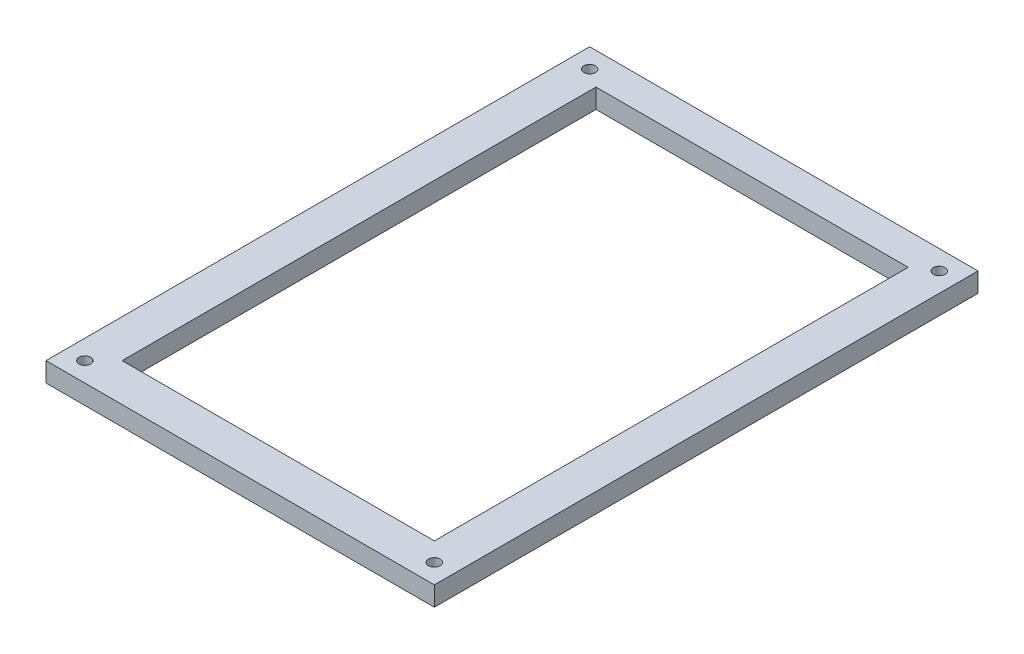
ISO-10303-21;
HEADER;
FILE_DESCRIPTION(('STEP AP214'),'2;1');
FILE_NAME('part.step','',(''),(''),'','','');
FILE_SCHEMA(('AUTOMOTIVE_DESIGN { 1 0 10303 214 1 1 1 1 }'));
ENDSEC;
DATA;
#1=APPLICATION_CONTEXT('core data for automotive mechanical design processes');
#2=APPLICATION_PROTOCOL_DEFINITION('international standard','automotive_design',2000,#1);
#3=PRODUCT_CONTEXT('',#1,'mechanical');
#4=PRODUCT('Part','Part','',(#3));
#5=PRODUCT_RELATED_PRODUCT_CATEGORY('part','',(#4));
#6=PRODUCT_DEFINITION_FORMATION('','',#4);
#7=PRODUCT_DEFINITION_CONTEXT('part definition',#1,'design');
#8=PRODUCT_DEFINITION('design','',#6,#7);
#9=PRODUCT_DEFINITION_SHAPE('','',#8);
#10=(LENGTH_UNIT() NAMED_UNIT(*) SI_UNIT(.MILLI.,.METRE.));
#11=(NAMED_UNIT(*) PLANE_ANGLE_UNIT() SI_UNIT($,.RADIAN.));
#12=(NAMED_UNIT(*) SI_UNIT($,.STERADIAN.) SOLID_ANGLE_UNIT());
#13=UNCERTAINTY_MEASURE_WITH_UNIT(LENGTH_MEASURE(1.E-05),#10,'distance_accuracy_value','');
#14=(GEOMETRIC_REPRESENTATION_CONTEXT(3) GLOBAL_UNCERTAINTY_ASSIGNED_CONTEXT((#13)) GLOBAL_UNIT_ASSIGNED_CONTEXT((#10,
#11,#12)) REPRESENTATION_CONTEXT('',''));
#15=CARTESIAN_POINT('',(0.,0.,0.));
#16=DIRECTION('',(0.,0.,1.));
#17=DIRECTION('',(1.,0.,0.));
#18=AXIS2_PLACEMENT_3D('',#15,#16,#17);
#19=CARTESIAN_POINT('',(0.,6.35,0.));
#20=DIRECTION('',(0.,-1.,0.));
#21=DIRECTION('',(0.,0.,-1.));
#22=AXIS2_PLACEMENT_3D('',#19,#20,#21);
#23=PLANE('',#22);
#24=CARTESIAN_POINT('',(120.65,6.35,-171.45));
#25=DIRECTION('',(0.,1.,0.));
#26=DIRECTION('',(0.,0.,-1.));
#27=AXIS2_PLACEMENT_3D('',#24,#25,#26);
#28=CIRCLE('',#27,1.90499999999998);
#29=CARTESIAN_POINT('',(120.65,6.35,-173.355));
#30=VERTEX_POINT('',#29);
#31=EDGE_CURVE('E255',#30,#30,#28,.T.);
#32=ORIENTED_EDGE('',*,*,#31,.F.);
#33=EDGE_LOOP('',(#32));
#34=FACE_BOUND('',#33,.T.);
#35=CARTESIAN_POINT('',(120.65,6.35,-6.34999999999999));
#36=DIRECTION('',(0.,1.,0.));
#37=DIRECTION('',(0.,0.,1.));
#38=AXIS2_PLACEMENT_3D('',#35,#36,#37);
#39=CIRCLE('',#38,1.90499999999998);
#40=CARTESIAN_POINT('',(120.65,6.35,-4.44500000000002));
#41=VERTEX_POINT('',#40);
#42=EDGE_CURVE('E249',#41,#41,#39,.T.);
#43=ORIENTED_EDGE('',*,*,#42,.F.);
#44=EDGE_LOOP('',(#43));
#45=FACE_BOUND('',#44,.T.);
#46=CARTESIAN_POINT('',(6.35,6.35,-6.34999999999999));
#47=DIRECTION('',(0.,1.,0.));
#48=DIRECTION('',(0.,0.,-1.));
#49=AXIS2_PLACEMENT_3D('',#46,#47,#48);
#50=CIRCLE('',#49,1.90499999999999);
#51=CARTESIAN_POINT('',(6.35,6.35,-8.25499999999999));
#52=VERTEX_POINT('',#51);
#53=EDGE_CURVE('E239',#52,#52,#50,.T.);
#54=ORIENTED_EDGE('',*,*,#53,.F.);
#55=EDGE_LOOP('',(#54));
#56=FACE_BOUND('',#55,.T.);
#57=CARTESIAN_POINT('',(6.35,6.35,-171.45));
#58=DIRECTION('',(0.,1.,0.));
#59=DIRECTION('',(0.,0.,1.));
#60=AXIS2_PLACEMENT_3D('',#57,#58,#59);
#61=CIRCLE('',#60,1.90499999999999);
#62=CARTESIAN_POINT('',(6.35,6.35,-169.545));
#63=VERTEX_POINT('',#62);
#64=EDGE_CURVE('E120',#63,#63,#61,.T.);
#65=ORIENTED_EDGE('',*,*,#64,.F.);
#66=EDGE_LOOP('',(#65));
#67=FACE_BOUND('',#66,.T.);
#68=DIRECTION('',(0.,0.,1.));
#69=VECTOR('',#68,1.);
#70=CARTESIAN_POINT('',(0.,6.35,0.));
#71=LINE('',#70,#69);
#72=CARTESIAN_POINT('',(0.,6.35,-177.8));
#73=VERTEX_POINT('',#72);
#74=CARTESIAN_POINT('',(0.,6.35,0.));
#75=VERTEX_POINT('',#74);
#76=EDGE_CURVE('E137',#73,#75,#71,.T.);
#77=ORIENTED_EDGE('',*,*,#76,.T.);
#78=DIRECTION('',(1.,0.,0.));
#79=VECTOR('',#78,1.);
#80=CARTESIAN_POINT('',(0.,6.35,0.));
#81=LINE('',#80,#79);
#82=CARTESIAN_POINT('',(127.,6.35,0.));
#83=VERTEX_POINT('',#82);
#84=EDGE_CURVE('E140',#75,#83,#81,.T.);
#85=ORIENTED_EDGE('',*,*,#84,.T.);
#86=DIRECTION('',(0.,0.,-1.));
#87=VECTOR('',#86,1.);
#88=CARTESIAN_POINT('',(127.,6.35,0.));
#89=LINE('',#88,#87);
#90=CARTESIAN_POINT('',(127.,6.35,-177.8));
#91=VERTEX_POINT('',#90);
#92=EDGE_CURVE('E143',#83,#91,#89,.T.);
#93=ORIENTED_EDGE('',*,*,#92,.T.);
#94=DIRECTION('',(-1.,0.,0.));
#95=VECTOR('',#94,1.);
#96=CARTESIAN_POINT('',(0.,6.35,-177.8));
#97=LINE('',#96,#95);
#98=EDGE_CURVE('E145',#91,#73,#97,.T.);
#99=ORIENTED_EDGE('',*,*,#98,.T.);
#100=EDGE_LOOP('',(#77,#85,#93,#99));
#101=FACE_BOUND('',#100,.T.);
#102=DIRECTION('',(0.,0.,1.));
#103=VECTOR('',#102,1.);
#104=CARTESIAN_POINT('',(114.554,6.35,0.));
#105=LINE('',#104,#103);
#106=CARTESIAN_POINT('',(114.554,6.35,-167.411684877131));
#107=VERTEX_POINT('',#106);
#108=CARTESIAN_POINT('',(114.554,6.35,-12.446));
#109=VERTEX_POINT('',#108);
#110=EDGE_CURVE('E47',#107,#109,#105,.T.);
#111=ORIENTED_EDGE('',*,*,#110,.T.);
#112=DIRECTION('',(1.,0.,0.));
#113=VECTOR('',#112,1.);
#114=CARTESIAN_POINT('',(0.,6.35,-12.446));
#115=LINE('',#114,#113);
#116=CARTESIAN_POINT('',(12.446,6.35,-12.446));
#117=VERTEX_POINT('',#116);
#118=EDGE_CURVE('E114',#117,#109,#115,.T.);
#119=ORIENTED_EDGE('',*,*,#118,.F.);
#120=DIRECTION('',(0.,0.,1.));
#121=VECTOR('',#120,1.);
#122=CARTESIAN_POINT('',(12.446,6.35,0.));
#123=LINE('',#122,#121);
#124=CARTESIAN_POINT('',(12.446,6.35,-167.411684877131));
#125=VERTEX_POINT('',#124);
#126=EDGE_CURVE('E117',#125,#117,#123,.T.);
#127=ORIENTED_EDGE('',*,*,#126,.F.);
#128=DIRECTION('',(1.,0.,0.));
#129=VECTOR('',#128,1.);
#130=CARTESIAN_POINT('',(0.,6.35,-167.411684877131));
#131=LINE('',#130,#129);
#132=EDGE_CURVE('E126',#125,#107,#131,.T.);
#133=ORIENTED_EDGE('',*,*,#132,.T.);
#134=EDGE_LOOP('',(#111,#119,#127,#133));
#135=FACE_BOUND('',#134,.T.);
#136=ADVANCED_FACE('F32',(#34,#45,#56,#67,#101,#135),#23,.F.);
#137=CARTESIAN_POINT('',(0.,0.,0.));
#138=DIRECTION('',(0.,-1.,0.));
#139=DIRECTION('',(0.,0.,-1.));
#140=AXIS2_PLACEMENT_3D('',#137,#138,#139);
#141=PLANE('',#140);
#142=CARTESIAN_POINT('',(120.65,0.,-171.45));
#143=DIRECTION('',(0.,1.,0.));
#144=DIRECTION('',(0.,0.,-1.));
#145=AXIS2_PLACEMENT_3D('',#142,#143,#144);
#146=CIRCLE('',#145,1.90499999999998);
#147=CARTESIAN_POINT('',(120.65,0.,-173.355));
#148=VERTEX_POINT('',#147);
#149=EDGE_CURVE('E252',#148,#148,#146,.T.);
#150=ORIENTED_EDGE('',*,*,#149,.T.);
#151=EDGE_LOOP('',(#150));
#152=FACE_BOUND('',#151,.T.);
#153=CARTESIAN_POINT('',(120.65,0.,-6.34999999999999));
#154=DIRECTION('',(0.,1.,0.));
#155=DIRECTION('',(0.,0.,1.));
#156=AXIS2_PLACEMENT_3D('',#153,#154,#155);
#157=CIRCLE('',#156,1.90499999999998);
#158=CARTESIAN_POINT('',(120.65,0.,-4.44500000000002));
#159=VERTEX_POINT('',#158);
#160=EDGE_CURVE('E244',#159,#159,#157,.T.);
#161=ORIENTED_EDGE('',*,*,#160,.T.);
#162=EDGE_LOOP('',(#161));
#163=FACE_BOUND('',#162,.T.);
#164=CARTESIAN_POINT('',(6.35,0.,-6.34999999999999));
#165=DIRECTION('',(0.,1.,0.));
#166=DIRECTION('',(0.,0.,-1.));
#167=AXIS2_PLACEMENT_3D('',#164,#165,#166);
#168=CIRCLE('',#167,1.90499999999999);
#169=CARTESIAN_POINT('',(6.35,0.,-8.25499999999999));
#170=VERTEX_POINT('',#169);
#171=EDGE_CURVE('E237',#170,#170,#168,.T.);
#172=ORIENTED_EDGE('',*,*,#171,.T.);
#173=EDGE_LOOP('',(#172));
#174=FACE_BOUND('',#173,.T.);
#175=CARTESIAN_POINT('',(6.35,0.,-171.45));
#176=DIRECTION('',(0.,1.,0.));
#177=DIRECTION('',(0.,0.,1.));
#178=AXIS2_PLACEMENT_3D('',#175,#176,#177);
#179=CIRCLE('',#178,1.90499999999999);
#180=CARTESIAN_POINT('',(6.35,0.,-169.545));
#181=VERTEX_POINT('',#180);
#182=EDGE_CURVE('E127',#181,#181,#179,.T.);
#183=ORIENTED_EDGE('',*,*,#182,.T.);
#184=EDGE_LOOP('',(#183));
#185=FACE_BOUND('',#184,.T.);
#186=DIRECTION('',(0.,0.,1.));
#187=VECTOR('',#186,1.);
#188=CARTESIAN_POINT('',(0.,0.,0.));
#189=LINE('',#188,#187);
#190=CARTESIAN_POINT('',(0.,0.,-177.8));
#191=VERTEX_POINT('',#190);
#192=CARTESIAN_POINT('',(0.,0.,0.));
#193=VERTEX_POINT('',#192);
#194=EDGE_CURVE('E133',#191,#193,#189,.T.);
#195=ORIENTED_EDGE('',*,*,#194,.F.);
#196=DIRECTION('',(-1.,0.,0.));
#197=VECTOR('',#196,1.);
#198=CARTESIAN_POINT('',(0.,0.,-177.8));
#199=LINE('',#198,#197);
#200=CARTESIAN_POINT('',(127.,0.,-177.8));
#201=VERTEX_POINT('',#200);
#202=EDGE_CURVE('E141',#201,#191,#199,.T.);
#203=ORIENTED_EDGE('',*,*,#202,.F.);
#204=DIRECTION('',(0.,0.,-1.));
#205=VECTOR('',#204,1.);
#206=CARTESIAN_POINT('',(127.,0.,0.));
#207=LINE('',#206,#205);
#208=CARTESIAN_POINT('',(127.,0.,0.));
#209=VERTEX_POINT('',#208);
#210=EDGE_CURVE('E152',#209,#201,#207,.T.);
#211=ORIENTED_EDGE('',*,*,#210,.F.);
#212=DIRECTION('',(1.,0.,0.));
#213=VECTOR('',#212,1.);
#214=CARTESIAN_POINT('',(0.,0.,0.));
#215=LINE('',#214,#213);
#216=EDGE_CURVE('E150',#193,#209,#215,.T.);
#217=ORIENTED_EDGE('',*,*,#216,.F.);
#218=EDGE_LOOP('',(#195,#203,#211,#217));
#219=FACE_BOUND('',#218,.T.);
#220=DIRECTION('',(1.,0.,0.));
#221=VECTOR('',#220,1.);
#222=CARTESIAN_POINT('',(0.,0.,-12.446));
#223=LINE('',#222,#221);
#224=CARTESIAN_POINT('',(12.446,0.,-12.446));
#225=VERTEX_POINT('',#224);
#226=CARTESIAN_POINT('',(114.554,0.,-12.446));
#227=VERTEX_POINT('',#226);
#228=EDGE_CURVE('E109',#225,#227,#223,.T.);
#229=ORIENTED_EDGE('',*,*,#228,.T.);
#230=DIRECTION('',(0.,0.,1.));
#231=VECTOR('',#230,1.);
#232=CARTESIAN_POINT('',(114.554,0.,0.));
#233=LINE('',#232,#231);
#234=CARTESIAN_POINT('',(114.554,0.,-167.411684877131));
#235=VERTEX_POINT('',#234);
#236=EDGE_CURVE('E105',#235,#227,#233,.T.);
#237=ORIENTED_EDGE('',*,*,#236,.F.);
#238=DIRECTION('',(1.,0.,0.));
#239=VECTOR('',#238,1.);
#240=CARTESIAN_POINT('',(0.,0.,-167.411684877131));
#241=LINE('',#240,#239);
#242=CARTESIAN_POINT('',(12.446,0.,-167.411684877131));
#243=VERTEX_POINT('',#242);
#244=EDGE_CURVE('E97',#243,#235,#241,.T.);
#245=ORIENTED_EDGE('',*,*,#244,.F.);
#246=DIRECTION('',(0.,0.,1.));
#247=VECTOR('',#246,1.);
#248=CARTESIAN_POINT('',(12.446,0.,0.));
#249=LINE('',#248,#247);
#250=EDGE_CURVE('E55',#243,#225,#249,.T.);
#251=ORIENTED_EDGE('',*,*,#250,.T.);
#252=EDGE_LOOP('',(#229,#237,#245,#251));
#253=FACE_BOUND('',#252,.T.);
#254=ADVANCED_FACE('F112',(#152,#163,#174,#185,#219,#253),#141,.T.);
#255=CARTESIAN_POINT('',(0.,6.35,0.));
#256=DIRECTION('',(1.,0.,0.));
#257=DIRECTION('',(0.,0.,-1.));
#258=AXIS2_PLACEMENT_3D('',#255,#256,#257);
#259=PLANE('',#258);
#260=ORIENTED_EDGE('',*,*,#194,.T.);
#261=DIRECTION('',(0.,-1.,0.));
#262=VECTOR('',#261,1.);
#263=CARTESIAN_POINT('',(0.,6.35,0.));
#264=LINE('',#263,#262);
#265=EDGE_CURVE('E11',#75,#193,#264,.T.);
#266=ORIENTED_EDGE('',*,*,#265,.F.);
#267=ORIENTED_EDGE('',*,*,#76,.F.);
#268=DIRECTION('',(0.,-1.,0.));
#269=VECTOR('',#268,1.);
#270=CARTESIAN_POINT('',(0.,6.35,-177.8));
#271=LINE('',#270,#269);
#272=EDGE_CURVE('E147',#73,#191,#271,.T.);
#273=ORIENTED_EDGE('',*,*,#272,.T.);
#274=EDGE_LOOP('',(#260,#266,#267,#273));
#275=FACE_BOUND('',#274,.T.);
#276=ADVANCED_FACE('F34',(#275),#259,.F.);
#277=CARTESIAN_POINT('',(0.,6.35,0.));
#278=DIRECTION('',(0.,0.,-1.));
#279=DIRECTION('',(-1.,0.,0.));
#280=AXIS2_PLACEMENT_3D('',#277,#278,#279);
#281=PLANE('',#280);
#282=ORIENTED_EDGE('',*,*,#216,.T.);
#283=DIRECTION('',(0.,-1.,0.));
#284=VECTOR('',#283,1.);
#285=CARTESIAN_POINT('',(127.,6.35,0.));
#286=LINE('',#285,#284);
#287=EDGE_CURVE('E40',#83,#209,#286,.T.);
#288=ORIENTED_EDGE('',*,*,#287,.F.);
#289=ORIENTED_EDGE('',*,*,#84,.F.);
#290=ORIENTED_EDGE('',*,*,#265,.T.);
#291=EDGE_LOOP('',(#282,#288,#289,#290));
#292=FACE_BOUND('',#291,.T.);
#293=ADVANCED_FACE('F179',(#292),#281,.F.);
#294=CARTESIAN_POINT('',(127.,6.35,0.));
#295=DIRECTION('',(-1.,0.,0.));
#296=DIRECTION('',(0.,0.,1.));
#297=AXIS2_PLACEMENT_3D('',#294,#295,#296);
#298=PLANE('',#297);
#299=ORIENTED_EDGE('',*,*,#210,.T.);
#300=DIRECTION('',(0.,-1.,0.));
#301=VECTOR('',#300,1.);
#302=CARTESIAN_POINT('',(127.,6.35,-177.8));
#303=LINE('',#302,#301);
#304=EDGE_CURVE('E157',#91,#201,#303,.T.);
#305=ORIENTED_EDGE('',*,*,#304,.F.);
#306=ORIENTED_EDGE('',*,*,#92,.F.);
#307=ORIENTED_EDGE('',*,*,#287,.T.);
#308=EDGE_LOOP('',(#299,#305,#306,#307));
#309=FACE_BOUND('',#308,.T.);
#310=ADVANCED_FACE('F164',(#309),#298,.F.);
#311=CARTESIAN_POINT('',(0.,6.35,-177.8));
#312=DIRECTION('',(0.,0.,1.));
#313=DIRECTION('',(1.,0.,0.));
#314=AXIS2_PLACEMENT_3D('',#311,#312,#313);
#315=PLANE('',#314);
#316=ORIENTED_EDGE('',*,*,#202,.T.);
#317=ORIENTED_EDGE('',*,*,#272,.F.);
#318=ORIENTED_EDGE('',*,*,#98,.F.);
#319=ORIENTED_EDGE('',*,*,#304,.T.);
#320=EDGE_LOOP('',(#316,#317,#318,#319));
#321=FACE_BOUND('',#320,.T.);
#322=ADVANCED_FACE('F172',(#321),#315,.F.);
#323=CARTESIAN_POINT('',(114.554,0.,0.));
#324=DIRECTION('',(-1.,0.,0.));
#325=DIRECTION('',(0.,0.,1.));
#326=AXIS2_PLACEMENT_3D('',#323,#324,#325);
#327=PLANE('',#326);
#328=ORIENTED_EDGE('',*,*,#110,.F.);
#329=DIRECTION('',(0.,1.,0.));
#330=VECTOR('',#329,1.);
#331=CARTESIAN_POINT('',(114.554,0.,-167.411684877131));
#332=LINE('',#331,#330);
#333=EDGE_CURVE('E100',#235,#107,#332,.T.);
#334=ORIENTED_EDGE('',*,*,#333,.F.);
#335=ORIENTED_EDGE('',*,*,#236,.T.);
#336=DIRECTION('',(0.,1.,0.));
#337=VECTOR('',#336,1.);
#338=CARTESIAN_POINT('',(114.554,0.,-12.446));
#339=LINE('',#338,#337);
#340=EDGE_CURVE('E131',#227,#109,#339,.T.);
#341=ORIENTED_EDGE('',*,*,#340,.T.);
#342=EDGE_LOOP('',(#328,#334,#335,#341));
#343=FACE_BOUND('',#342,.T.);
#344=ADVANCED_FACE('F107',(#343),#327,.T.);
#345=CARTESIAN_POINT('',(0.,0.,-12.446));
#346=DIRECTION('',(0.,0.,1.));
#347=DIRECTION('',(1.,0.,0.));
#348=AXIS2_PLACEMENT_3D('',#345,#346,#347);
#349=PLANE('',#348);
#350=ORIENTED_EDGE('',*,*,#118,.T.);
#351=ORIENTED_EDGE('',*,*,#340,.F.);
#352=ORIENTED_EDGE('',*,*,#228,.F.);
#353=DIRECTION('',(0.,1.,0.));
#354=VECTOR('',#353,1.);
#355=CARTESIAN_POINT('',(12.446,0.,-12.446));
#356=LINE('',#355,#354);
#357=EDGE_CURVE('E134',#225,#117,#356,.T.);
#358=ORIENTED_EDGE('',*,*,#357,.T.);
#359=EDGE_LOOP('',(#350,#351,#352,#358));
#360=FACE_BOUND('',#359,.T.);
#361=ADVANCED_FACE('F205',(#360),#349,.F.);
#362=CARTESIAN_POINT('',(12.446,0.,0.));
#363=DIRECTION('',(-1.,0.,0.));
#364=DIRECTION('',(0.,0.,1.));
#365=AXIS2_PLACEMENT_3D('',#362,#363,#364);
#366=PLANE('',#365);
#367=ORIENTED_EDGE('',*,*,#126,.T.);
#368=ORIENTED_EDGE('',*,*,#357,.F.);
#369=ORIENTED_EDGE('',*,*,#250,.F.);
#370=DIRECTION('',(0.,1.,0.));
#371=VECTOR('',#370,1.);
#372=CARTESIAN_POINT('',(12.446,0.,-167.411684877131));
#373=LINE('',#372,#371);
#374=EDGE_CURVE('E102',#243,#125,#373,.T.);
#375=ORIENTED_EDGE('',*,*,#374,.T.);
#376=EDGE_LOOP('',(#367,#368,#369,#375));
#377=FACE_BOUND('',#376,.T.);
#378=ADVANCED_FACE('F210',(#377),#366,.F.);
#379=CARTESIAN_POINT('',(0.,0.,-167.411684877131));
#380=DIRECTION('',(0.,0.,1.));
#381=DIRECTION('',(1.,0.,0.));
#382=AXIS2_PLACEMENT_3D('',#379,#380,#381);
#383=PLANE('',#382);
#384=ORIENTED_EDGE('',*,*,#132,.F.);
#385=ORIENTED_EDGE('',*,*,#374,.F.);
#386=ORIENTED_EDGE('',*,*,#244,.T.);
#387=ORIENTED_EDGE('',*,*,#333,.T.);
#388=EDGE_LOOP('',(#384,#385,#386,#387));
#389=FACE_BOUND('',#388,.T.);
#390=ADVANCED_FACE('F99',(#389),#383,.T.);
#391=CARTESIAN_POINT('',(6.35,0.,-171.45));
#392=DIRECTION('',(0.,1.,0.));
#393=DIRECTION('',(0.,0.,1.));
#394=AXIS2_PLACEMENT_3D('',#391,#392,#393);
#395=CYLINDRICAL_SURFACE('',#394,1.90499999999999);
#396=ORIENTED_EDGE('',*,*,#182,.F.);
#397=EDGE_LOOP('',(#396));
#398=FACE_BOUND('',#397,.T.);
#399=ORIENTED_EDGE('',*,*,#64,.T.);
#400=EDGE_LOOP('',(#399));
#401=FACE_BOUND('',#400,.T.);
#402=ADVANCED_FACE('F218',(#398,#401),#395,.F.);
#403=CARTESIAN_POINT('',(6.35,0.,-6.34999999999999));
#404=DIRECTION('',(0.,1.,0.));
#405=DIRECTION('',(0.,0.,1.));
#406=AXIS2_PLACEMENT_3D('',#403,#404,#405);
#407=CYLINDRICAL_SURFACE('',#406,1.90499999999999);
#408=ORIENTED_EDGE('',*,*,#171,.F.);
#409=EDGE_LOOP('',(#408));
#410=FACE_BOUND('',#409,.T.);
#411=ORIENTED_EDGE('',*,*,#53,.T.);
#412=EDGE_LOOP('',(#411));
#413=FACE_BOUND('',#412,.T.);
#414=ADVANCED_FACE('F223',(#410,#413),#407,.F.);
#415=CARTESIAN_POINT('',(120.65,0.,-6.34999999999999));
#416=DIRECTION('',(0.,1.,0.));
#417=DIRECTION('',(0.,0.,1.));
#418=AXIS2_PLACEMENT_3D('',#415,#416,#417);
#419=CYLINDRICAL_SURFACE('',#418,1.90499999999998);
#420=ORIENTED_EDGE('',*,*,#160,.F.);
#421=EDGE_LOOP('',(#420));
#422=FACE_BOUND('',#421,.T.);
#423=ORIENTED_EDGE('',*,*,#42,.T.);
#424=EDGE_LOOP('',(#423));
#425=FACE_BOUND('',#424,.T.);
#426=ADVANCED_FACE('F228',(#422,#425),#419,.F.);
#427=CARTESIAN_POINT('',(120.65,0.,-171.45));
#428=DIRECTION('',(0.,1.,0.));
#429=DIRECTION('',(0.,0.,1.));
#430=AXIS2_PLACEMENT_3D('',#427,#428,#429);
#431=CYLINDRICAL_SURFACE('',#430,1.90499999999998);
#432=ORIENTED_EDGE('',*,*,#149,.F.);
#433=EDGE_LOOP('',(#432));
#434=FACE_BOUND('',#433,.T.);
#435=ORIENTED_EDGE('',*,*,#31,.T.);
#436=EDGE_LOOP('',(#435));
#437=FACE_BOUND('',#436,.T.);
#438=ADVANCED_FACE('F258',(#434,#437),#431,.F.);
#439=CLOSED_SHELL('',(#136,#254,#276,#293,#310,#322,#344,#361,#378,#390,#402,#414,#426,#438));
#440=MANIFOLD_SOLID_BREP('B2',#439);
#441=ADVANCED_BREP_SHAPE_REPRESENTATION('',(#18,#440),#14);
#442=SHAPE_DEFINITION_REPRESENTATION(#9,#441);
ENDSEC;
END-ISO-10303-21;
